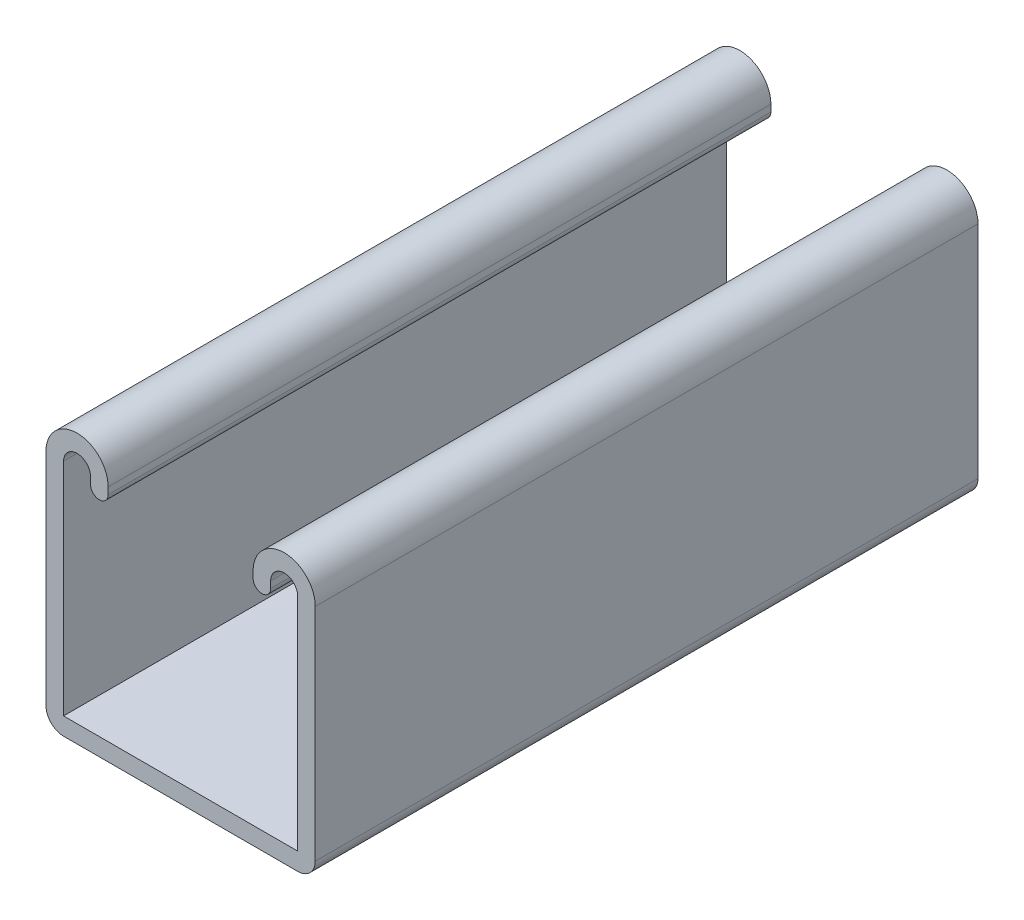
ISO-10303-21;
HEADER;
FILE_DESCRIPTION(('STEP AP214'),'2;1');
FILE_NAME('part.step','',(''),(''),'','','');
FILE_SCHEMA(('AUTOMOTIVE_DESIGN { 1 0 10303 214 1 1 1 1 }'));
ENDSEC;
DATA;
#1=APPLICATION_CONTEXT('core data for automotive mechanical design processes');
#2=APPLICATION_PROTOCOL_DEFINITION('international standard','automotive_design',2000,#1);
#3=PRODUCT_CONTEXT('',#1,'mechanical');
#4=PRODUCT('Part','Part','',(#3));
#5=PRODUCT_RELATED_PRODUCT_CATEGORY('part','',(#4));
#6=PRODUCT_DEFINITION_FORMATION('','',#4);
#7=PRODUCT_DEFINITION_CONTEXT('part definition',#1,'design');
#8=PRODUCT_DEFINITION('design','',#6,#7);
#9=PRODUCT_DEFINITION_SHAPE('','',#8);
#10=(LENGTH_UNIT() NAMED_UNIT(*) SI_UNIT(.MILLI.,.METRE.));
#11=(NAMED_UNIT(*) PLANE_ANGLE_UNIT() SI_UNIT($,.RADIAN.));
#12=(NAMED_UNIT(*) SI_UNIT($,.STERADIAN.) SOLID_ANGLE_UNIT());
#13=UNCERTAINTY_MEASURE_WITH_UNIT(LENGTH_MEASURE(1.E-05),#10,'distance_accuracy_value','');
#14=(GEOMETRIC_REPRESENTATION_CONTEXT(3) GLOBAL_UNCERTAINTY_ASSIGNED_CONTEXT((#13)) GLOBAL_UNIT_ASSIGNED_CONTEXT((#10,
#11,#12)) REPRESENTATION_CONTEXT('',''));
#15=CARTESIAN_POINT('',(0.,0.,0.));
#16=DIRECTION('',(0.,0.,1.));
#17=DIRECTION('',(1.,0.,0.));
#18=AXIS2_PLACEMENT_3D('',#15,#16,#17);
#19=CARTESIAN_POINT('',(-15.875,18.4785,101.6));
#20=DIRECTION('',(0.,0.,-1.));
#21=DIRECTION('',(-1.,0.,0.));
#22=AXIS2_PLACEMENT_3D('',#19,#20,#21);
#23=CYLINDRICAL_SURFACE('',#22,4.7625);
#24=CARTESIAN_POINT('',(-15.875,18.4785,0.));
#25=DIRECTION('',(0.,0.,1.));
#26=DIRECTION('',(-1.,0.,0.));
#27=AXIS2_PLACEMENT_3D('',#24,#25,#26);
#28=CIRCLE('',#27,4.7625);
#29=CARTESIAN_POINT('',(-11.1125,18.4785,0.));
#30=VERTEX_POINT('',#29);
#31=CARTESIAN_POINT('',(-20.6375,18.4785,0.));
#32=VERTEX_POINT('',#31);
#33=EDGE_CURVE('E189',#30,#32,#28,.T.);
#34=ORIENTED_EDGE('',*,*,#33,.T.);
#35=DIRECTION('',(0.,0.,-1.));
#36=VECTOR('',#35,1.);
#37=CARTESIAN_POINT('',(-20.6375,18.4785,101.6));
#38=LINE('',#37,#36);
#39=CARTESIAN_POINT('',(-20.6375,18.4785,101.6));
#40=VERTEX_POINT('',#39);
#41=EDGE_CURVE('E11',#40,#32,#38,.T.);
#42=ORIENTED_EDGE('',*,*,#41,.F.);
#43=CARTESIAN_POINT('',(-15.875,18.4785,101.6));
#44=DIRECTION('',(0.,0.,1.));
#45=DIRECTION('',(-1.,0.,0.));
#46=AXIS2_PLACEMENT_3D('',#43,#44,#45);
#47=CIRCLE('',#46,4.7625);
#48=CARTESIAN_POINT('',(-11.1125,18.4785,101.6));
#49=VERTEX_POINT('',#48);
#50=EDGE_CURVE('E223',#49,#40,#47,.T.);
#51=ORIENTED_EDGE('',*,*,#50,.F.);
#52=DIRECTION('',(0.,0.,-1.));
#53=VECTOR('',#52,1.);
#54=CARTESIAN_POINT('',(-11.1125,18.4785,101.6));
#55=LINE('',#54,#53);
#56=EDGE_CURVE('E185',#49,#30,#55,.T.);
#57=ORIENTED_EDGE('',*,*,#56,.T.);
#58=EDGE_LOOP('',(#34,#42,#51,#57));
#59=FACE_BOUND('',#58,.T.);
#60=ADVANCED_FACE('F32',(#59),#23,.T.);
#61=CARTESIAN_POINT('',(-20.6375,18.4785,101.6));
#62=DIRECTION('',(1.,0.,0.));
#63=DIRECTION('',(0.,1.,0.));
#64=AXIS2_PLACEMENT_3D('',#61,#62,#63);
#65=PLANE('',#64);
#66=DIRECTION('',(0.,-1.,0.));
#67=VECTOR('',#66,1.);
#68=CARTESIAN_POINT('',(-20.6375,18.4785,0.));
#69=LINE('',#68,#67);
#70=CARTESIAN_POINT('',(-20.6375,-15.3416,0.));
#71=VERTEX_POINT('',#70);
#72=EDGE_CURVE('E192',#32,#71,#69,.T.);
#73=ORIENTED_EDGE('',*,*,#72,.T.);
#74=DIRECTION('',(0.,0.,-1.));
#75=VECTOR('',#74,1.);
#76=CARTESIAN_POINT('',(-20.6375,-15.3416,101.6));
#77=LINE('',#76,#75);
#78=CARTESIAN_POINT('',(-20.6375,-15.3416,101.6));
#79=VERTEX_POINT('',#78);
#80=EDGE_CURVE('E41',#79,#71,#77,.T.);
#81=ORIENTED_EDGE('',*,*,#80,.F.);
#82=DIRECTION('',(0.,-1.,0.));
#83=VECTOR('',#82,1.);
#84=CARTESIAN_POINT('',(-20.6375,18.4785,101.6));
#85=LINE('',#84,#83);
#86=EDGE_CURVE('E122',#40,#79,#85,.T.);
#87=ORIENTED_EDGE('',*,*,#86,.F.);
#88=ORIENTED_EDGE('',*,*,#41,.T.);
#89=EDGE_LOOP('',(#73,#81,#87,#88));
#90=FACE_BOUND('',#89,.T.);
#91=ADVANCED_FACE('F332',(#90),#65,.F.);
#92=CARTESIAN_POINT('',(-17.9451,-15.3416,101.6));
#93=DIRECTION('',(0.,0.,-1.));
#94=DIRECTION('',(-1.,0.,0.));
#95=AXIS2_PLACEMENT_3D('',#92,#93,#94);
#96=CYLINDRICAL_SURFACE('',#95,2.6924);
#97=CARTESIAN_POINT('',(-17.9451,-15.3416,0.));
#98=DIRECTION('',(0.,0.,1.));
#99=DIRECTION('',(-1.,0.,0.));
#100=AXIS2_PLACEMENT_3D('',#97,#98,#99);
#101=CIRCLE('',#100,2.6924);
#102=CARTESIAN_POINT('',(-17.9451,-18.034,0.));
#103=VERTEX_POINT('',#102);
#104=EDGE_CURVE('E194',#71,#103,#101,.T.);
#105=ORIENTED_EDGE('',*,*,#104,.T.);
#106=DIRECTION('',(0.,0.,-1.));
#107=VECTOR('',#106,1.);
#108=CARTESIAN_POINT('',(-17.9451,-18.034,101.6));
#109=LINE('',#108,#107);
#110=CARTESIAN_POINT('',(-17.9451,-18.034,101.6));
#111=VERTEX_POINT('',#110);
#112=EDGE_CURVE('E260',#111,#103,#109,.T.);
#113=ORIENTED_EDGE('',*,*,#112,.F.);
#114=CARTESIAN_POINT('',(-17.9451,-15.3416,101.6));
#115=DIRECTION('',(0.,0.,1.));
#116=DIRECTION('',(-1.,0.,0.));
#117=AXIS2_PLACEMENT_3D('',#114,#115,#116);
#118=CIRCLE('',#117,2.6924);
#119=EDGE_CURVE('E269',#79,#111,#118,.T.);
#120=ORIENTED_EDGE('',*,*,#119,.F.);
#121=ORIENTED_EDGE('',*,*,#80,.T.);
#122=EDGE_LOOP('',(#105,#113,#120,#121));
#123=FACE_BOUND('',#122,.T.);
#124=ADVANCED_FACE('F267',(#123),#96,.T.);
#125=CARTESIAN_POINT('',(-17.9451,-18.034,101.6));
#126=DIRECTION('',(0.,1.,0.));
#127=DIRECTION('',(-1.,0.,0.));
#128=AXIS2_PLACEMENT_3D('',#125,#126,#127);
#129=PLANE('',#128);
#130=CARTESIAN_POINT('',(0.,-18.034,71.4375));
#131=DIRECTION('',(0.,-1.,0.));
#132=DIRECTION('',(1.,0.,0.));
#133=AXIS2_PLACEMENT_3D('',#130,#131,#132);
#134=CIRCLE('',#133,7.14375);
#135=CARTESIAN_POINT('',(7.14375,-18.034,71.4375));
#136=VERTEX_POINT('',#135);
#137=EDGE_CURVE('E451',#136,#136,#134,.T.);
#138=ORIENTED_EDGE('',*,*,#137,.F.);
#139=EDGE_LOOP('',(#138));
#140=FACE_BOUND('',#139,.T.);
#141=CARTESIAN_POINT('',(0.,-18.034,23.8125));
#142=DIRECTION('',(0.,-1.,0.));
#143=DIRECTION('',(1.,0.,0.));
#144=AXIS2_PLACEMENT_3D('',#141,#142,#143);
#145=CIRCLE('',#144,7.14375);
#146=CARTESIAN_POINT('',(7.14375,-18.034,23.8125));
#147=VERTEX_POINT('',#146);
#148=EDGE_CURVE('E455',#147,#147,#145,.T.);
#149=ORIENTED_EDGE('',*,*,#148,.F.);
#150=EDGE_LOOP('',(#149));
#151=FACE_BOUND('',#150,.T.);
#152=DIRECTION('',(1.,0.,0.));
#153=VECTOR('',#152,1.);
#154=CARTESIAN_POINT('',(-17.9451,-18.034,0.));
#155=LINE('',#154,#153);
#156=CARTESIAN_POINT('',(17.9451,-18.034,0.));
#157=VERTEX_POINT('',#156);
#158=EDGE_CURVE('E196',#103,#157,#155,.T.);
#159=ORIENTED_EDGE('',*,*,#158,.T.);
#160=DIRECTION('',(0.,0.,-1.));
#161=VECTOR('',#160,1.);
#162=CARTESIAN_POINT('',(17.9451,-18.034,101.6));
#163=LINE('',#162,#161);
#164=CARTESIAN_POINT('',(17.9451,-18.034,101.6));
#165=VERTEX_POINT('',#164);
#166=EDGE_CURVE('E257',#165,#157,#163,.T.);
#167=ORIENTED_EDGE('',*,*,#166,.F.);
#168=DIRECTION('',(1.,0.,0.));
#169=VECTOR('',#168,1.);
#170=CARTESIAN_POINT('',(-17.9451,-18.034,101.6));
#171=LINE('',#170,#169);
#172=EDGE_CURVE('E287',#111,#165,#171,.T.);
#173=ORIENTED_EDGE('',*,*,#172,.F.);
#174=ORIENTED_EDGE('',*,*,#112,.T.);
#175=EDGE_LOOP('',(#159,#167,#173,#174));
#176=FACE_BOUND('',#175,.T.);
#177=ADVANCED_FACE('F278',(#140,#151,#176),#129,.F.);
#178=CARTESIAN_POINT('',(17.9451,-15.3416,101.6));
#179=DIRECTION('',(0.,0.,-1.));
#180=DIRECTION('',(-1.,0.,0.));
#181=AXIS2_PLACEMENT_3D('',#178,#179,#180);
#182=CYLINDRICAL_SURFACE('',#181,2.6924);
#183=CARTESIAN_POINT('',(17.9451,-15.3416,0.));
#184=DIRECTION('',(0.,0.,1.));
#185=DIRECTION('',(1.,0.,0.));
#186=AXIS2_PLACEMENT_3D('',#183,#184,#185);
#187=CIRCLE('',#186,2.6924);
#188=CARTESIAN_POINT('',(20.6375,-15.3416,0.));
#189=VERTEX_POINT('',#188);
#190=EDGE_CURVE('E198',#157,#189,#187,.T.);
#191=ORIENTED_EDGE('',*,*,#190,.T.);
#192=DIRECTION('',(0.,0.,-1.));
#193=VECTOR('',#192,1.);
#194=CARTESIAN_POINT('',(20.6375,-15.3416,101.6));
#195=LINE('',#194,#193);
#196=CARTESIAN_POINT('',(20.6375,-15.3416,101.6));
#197=VERTEX_POINT('',#196);
#198=EDGE_CURVE('E254',#197,#189,#195,.T.);
#199=ORIENTED_EDGE('',*,*,#198,.F.);
#200=CARTESIAN_POINT('',(17.9451,-15.3416,101.6));
#201=DIRECTION('',(0.,0.,1.));
#202=DIRECTION('',(1.,0.,0.));
#203=AXIS2_PLACEMENT_3D('',#200,#201,#202);
#204=CIRCLE('',#203,2.6924);
#205=EDGE_CURVE('E284',#165,#197,#204,.T.);
#206=ORIENTED_EDGE('',*,*,#205,.F.);
#207=ORIENTED_EDGE('',*,*,#166,.T.);
#208=EDGE_LOOP('',(#191,#199,#206,#207));
#209=FACE_BOUND('',#208,.T.);
#210=ADVANCED_FACE('F282',(#209),#182,.T.);
#211=CARTESIAN_POINT('',(20.6375,-15.3416,101.6));
#212=DIRECTION('',(-1.,0.,0.));
#213=DIRECTION('',(0.,0.,1.));
#214=AXIS2_PLACEMENT_3D('',#211,#212,#213);
#215=PLANE('',#214);
#216=DIRECTION('',(0.,1.,0.));
#217=VECTOR('',#216,1.);
#218=CARTESIAN_POINT('',(20.6375,-15.3416,0.));
#219=LINE('',#218,#217);
#220=CARTESIAN_POINT('',(20.6375,18.4785,0.));
#221=VERTEX_POINT('',#220);
#222=EDGE_CURVE('E200',#189,#221,#219,.T.);
#223=ORIENTED_EDGE('',*,*,#222,.T.);
#224=DIRECTION('',(0.,0.,-1.));
#225=VECTOR('',#224,1.);
#226=CARTESIAN_POINT('',(20.6375,18.4785,101.6));
#227=LINE('',#226,#225);
#228=CARTESIAN_POINT('',(20.6375,18.4785,101.6));
#229=VERTEX_POINT('',#228);
#230=EDGE_CURVE('E251',#229,#221,#227,.T.);
#231=ORIENTED_EDGE('',*,*,#230,.F.);
#232=DIRECTION('',(0.,1.,0.));
#233=VECTOR('',#232,1.);
#234=CARTESIAN_POINT('',(20.6375,-15.3416,101.6));
#235=LINE('',#234,#233);
#236=EDGE_CURVE('E286',#197,#229,#235,.T.);
#237=ORIENTED_EDGE('',*,*,#236,.F.);
#238=ORIENTED_EDGE('',*,*,#198,.T.);
#239=EDGE_LOOP('',(#223,#231,#237,#238));
#240=FACE_BOUND('',#239,.T.);
#241=ADVANCED_FACE('F346',(#240),#215,.F.);
#242=CARTESIAN_POINT('',(15.875,18.4785,101.6));
#243=DIRECTION('',(0.,0.,-1.));
#244=DIRECTION('',(-1.,0.,0.));
#245=AXIS2_PLACEMENT_3D('',#242,#243,#244);
#246=CYLINDRICAL_SURFACE('',#245,4.7625);
#247=CARTESIAN_POINT('',(15.875,18.4785,0.));
#248=DIRECTION('',(0.,0.,1.));
#249=DIRECTION('',(1.,0.,0.));
#250=AXIS2_PLACEMENT_3D('',#247,#248,#249);
#251=CIRCLE('',#250,4.7625);
#252=CARTESIAN_POINT('',(11.1125,18.4785,0.));
#253=VERTEX_POINT('',#252);
#254=EDGE_CURVE('E202',#221,#253,#251,.T.);
#255=ORIENTED_EDGE('',*,*,#254,.T.);
#256=DIRECTION('',(0.,0.,-1.));
#257=VECTOR('',#256,1.);
#258=CARTESIAN_POINT('',(11.1125,18.4785,101.6));
#259=LINE('',#258,#257);
#260=CARTESIAN_POINT('',(11.1125,18.4785,101.6));
#261=VERTEX_POINT('',#260);
#262=EDGE_CURVE('E248',#261,#253,#259,.T.);
#263=ORIENTED_EDGE('',*,*,#262,.F.);
#264=CARTESIAN_POINT('',(15.875,18.4785,101.6));
#265=DIRECTION('',(0.,0.,1.));
#266=DIRECTION('',(1.,0.,0.));
#267=AXIS2_PLACEMENT_3D('',#264,#265,#266);
#268=CIRCLE('',#267,4.7625);
#269=EDGE_CURVE('E289',#229,#261,#268,.T.);
#270=ORIENTED_EDGE('',*,*,#269,.F.);
#271=ORIENTED_EDGE('',*,*,#230,.T.);
#272=EDGE_LOOP('',(#255,#263,#270,#271));
#273=FACE_BOUND('',#272,.T.);
#274=ADVANCED_FACE('F349',(#273),#246,.T.);
#275=CARTESIAN_POINT('',(11.1125,18.4785,101.6));
#276=DIRECTION('',(1.,0.,0.));
#277=DIRECTION('',(0.,1.,0.));
#278=AXIS2_PLACEMENT_3D('',#275,#276,#277);
#279=PLANE('',#278);
#280=DIRECTION('',(0.,-1.,0.));
#281=VECTOR('',#280,1.);
#282=CARTESIAN_POINT('',(11.1125,18.4785,0.));
#283=LINE('',#282,#281);
#284=CARTESIAN_POINT('',(11.1125,17.44345,0.));
#285=VERTEX_POINT('',#284);
#286=EDGE_CURVE('E204',#253,#285,#283,.T.);
#287=ORIENTED_EDGE('',*,*,#286,.T.);
#288=DIRECTION('',(0.,0.,-1.));
#289=VECTOR('',#288,1.);
#290=CARTESIAN_POINT('',(11.1125,17.44345,101.6));
#291=LINE('',#290,#289);
#292=CARTESIAN_POINT('',(11.1125,17.44345,101.6));
#293=VERTEX_POINT('',#292);
#294=EDGE_CURVE('E245',#293,#285,#291,.T.);
#295=ORIENTED_EDGE('',*,*,#294,.F.);
#296=DIRECTION('',(0.,-1.,0.));
#297=VECTOR('',#296,1.);
#298=CARTESIAN_POINT('',(11.1125,18.4785,101.6));
#299=LINE('',#298,#297);
#300=EDGE_CURVE('E295',#261,#293,#299,.T.);
#301=ORIENTED_EDGE('',*,*,#300,.F.);
#302=ORIENTED_EDGE('',*,*,#262,.T.);
#303=EDGE_LOOP('',(#287,#295,#301,#302));
#304=FACE_BOUND('',#303,.T.);
#305=ADVANCED_FACE('F353',(#304),#279,.F.);
#306=CARTESIAN_POINT('',(12.4587,17.44345,101.6));
#307=DIRECTION('',(0.,0.,-1.));
#308=DIRECTION('',(-1.,0.,0.));
#309=AXIS2_PLACEMENT_3D('',#306,#307,#308);
#310=CYLINDRICAL_SURFACE('',#309,1.3462);
#311=CARTESIAN_POINT('',(12.4587,17.44345,0.));
#312=DIRECTION('',(0.,0.,1.));
#313=DIRECTION('',(1.,0.,0.));
#314=AXIS2_PLACEMENT_3D('',#311,#312,#313);
#315=CIRCLE('',#314,1.3462);
#316=CARTESIAN_POINT('',(13.8049,17.44345,0.));
#317=VERTEX_POINT('',#316);
#318=EDGE_CURVE('E206',#285,#317,#315,.T.);
#319=ORIENTED_EDGE('',*,*,#318,.T.);
#320=DIRECTION('',(0.,0.,-1.));
#321=VECTOR('',#320,1.);
#322=CARTESIAN_POINT('',(13.8049,17.44345,101.6));
#323=LINE('',#322,#321);
#324=CARTESIAN_POINT('',(13.8049,17.44345,101.6));
#325=VERTEX_POINT('',#324);
#326=EDGE_CURVE('E242',#325,#317,#323,.T.);
#327=ORIENTED_EDGE('',*,*,#326,.F.);
#328=CARTESIAN_POINT('',(12.4587,17.44345,101.6));
#329=DIRECTION('',(0.,0.,1.));
#330=DIRECTION('',(1.,0.,0.));
#331=AXIS2_PLACEMENT_3D('',#328,#329,#330);
#332=CIRCLE('',#331,1.3462);
#333=EDGE_CURVE('E297',#293,#325,#332,.T.);
#334=ORIENTED_EDGE('',*,*,#333,.F.);
#335=ORIENTED_EDGE('',*,*,#294,.T.);
#336=EDGE_LOOP('',(#319,#327,#334,#335));
#337=FACE_BOUND('',#336,.T.);
#338=ADVANCED_FACE('F357',(#337),#310,.T.);
#339=CARTESIAN_POINT('',(13.8049,18.4785,101.6));
#340=DIRECTION('',(-1.,0.,0.));
#341=DIRECTION('',(0.,0.,1.));
#342=AXIS2_PLACEMENT_3D('',#339,#340,#341);
#343=PLANE('',#342);
#344=DIRECTION('',(0.,1.,0.));
#345=VECTOR('',#344,1.);
#346=CARTESIAN_POINT('',(13.8049,18.4785,0.));
#347=LINE('',#346,#345);
#348=CARTESIAN_POINT('',(13.8049,18.4785,0.));
#349=VERTEX_POINT('',#348);
#350=EDGE_CURVE('E208',#317,#349,#347,.T.);
#351=ORIENTED_EDGE('',*,*,#350,.T.);
#352=DIRECTION('',(0.,0.,-1.));
#353=VECTOR('',#352,1.);
#354=CARTESIAN_POINT('',(13.8049,18.4785,101.6));
#355=LINE('',#354,#353);
#356=CARTESIAN_POINT('',(13.8049,18.4785,101.6));
#357=VERTEX_POINT('',#356);
#358=EDGE_CURVE('E239',#357,#349,#355,.T.);
#359=ORIENTED_EDGE('',*,*,#358,.F.);
#360=DIRECTION('',(0.,1.,0.));
#361=VECTOR('',#360,1.);
#362=CARTESIAN_POINT('',(13.8049,18.4785,101.6));
#363=LINE('',#362,#361);
#364=EDGE_CURVE('E299',#325,#357,#363,.T.);
#365=ORIENTED_EDGE('',*,*,#364,.F.);
#366=ORIENTED_EDGE('',*,*,#326,.T.);
#367=EDGE_LOOP('',(#351,#359,#365,#366));
#368=FACE_BOUND('',#367,.T.);
#369=ADVANCED_FACE('F361',(#368),#343,.F.);
#370=CARTESIAN_POINT('',(15.875,18.4785,101.6));
#371=DIRECTION('',(0.,0.,-1.));
#372=DIRECTION('',(-1.,0.,0.));
#373=AXIS2_PLACEMENT_3D('',#370,#371,#372);
#374=CYLINDRICAL_SURFACE('',#373,2.0701);
#375=CARTESIAN_POINT('',(15.875,18.4785,0.));
#376=DIRECTION('',(0.,0.,-1.));
#377=DIRECTION('',(1.,0.,0.));
#378=AXIS2_PLACEMENT_3D('',#375,#376,#377);
#379=CIRCLE('',#378,2.0701);
#380=CARTESIAN_POINT('',(17.9451,18.4785,0.));
#381=VERTEX_POINT('',#380);
#382=EDGE_CURVE('E210',#349,#381,#379,.T.);
#383=ORIENTED_EDGE('',*,*,#382,.T.);
#384=DIRECTION('',(0.,0.,-1.));
#385=VECTOR('',#384,1.);
#386=CARTESIAN_POINT('',(17.9451,18.4785,101.6));
#387=LINE('',#386,#385);
#388=CARTESIAN_POINT('',(17.9451,18.4785,101.6));
#389=VERTEX_POINT('',#388);
#390=EDGE_CURVE('E236',#389,#381,#387,.T.);
#391=ORIENTED_EDGE('',*,*,#390,.F.);
#392=CARTESIAN_POINT('',(15.875,18.4785,101.6));
#393=DIRECTION('',(0.,0.,-1.));
#394=DIRECTION('',(1.,0.,0.));
#395=AXIS2_PLACEMENT_3D('',#392,#393,#394);
#396=CIRCLE('',#395,2.0701);
#397=EDGE_CURVE('E301',#357,#389,#396,.T.);
#398=ORIENTED_EDGE('',*,*,#397,.F.);
#399=ORIENTED_EDGE('',*,*,#358,.T.);
#400=EDGE_LOOP('',(#383,#391,#398,#399));
#401=FACE_BOUND('',#400,.T.);
#402=ADVANCED_FACE('F365',(#401),#374,.F.);
#403=CARTESIAN_POINT('',(17.9451,-15.3416,101.6));
#404=DIRECTION('',(1.,0.,0.));
#405=DIRECTION('',(0.,1.,0.));
#406=AXIS2_PLACEMENT_3D('',#403,#404,#405);
#407=PLANE('',#406);
#408=DIRECTION('',(0.,-1.,0.));
#409=VECTOR('',#408,1.);
#410=CARTESIAN_POINT('',(17.9451,-15.3416,0.));
#411=LINE('',#410,#409);
#412=CARTESIAN_POINT('',(17.9451,-15.3416,0.));
#413=VERTEX_POINT('',#412);
#414=EDGE_CURVE('E212',#381,#413,#411,.T.);
#415=ORIENTED_EDGE('',*,*,#414,.T.);
#416=DIRECTION('',(0.,0.,-1.));
#417=VECTOR('',#416,1.);
#418=CARTESIAN_POINT('',(17.9451,-15.3416,101.6));
#419=LINE('',#418,#417);
#420=CARTESIAN_POINT('',(17.9451,-15.3416,101.6));
#421=VERTEX_POINT('',#420);
#422=EDGE_CURVE('E233',#421,#413,#419,.T.);
#423=ORIENTED_EDGE('',*,*,#422,.F.);
#424=DIRECTION('',(0.,-1.,0.));
#425=VECTOR('',#424,1.);
#426=CARTESIAN_POINT('',(17.9451,-15.3416,101.6));
#427=LINE('',#426,#425);
#428=EDGE_CURVE('E303',#389,#421,#427,.T.);
#429=ORIENTED_EDGE('',*,*,#428,.F.);
#430=ORIENTED_EDGE('',*,*,#390,.T.);
#431=EDGE_LOOP('',(#415,#423,#429,#430));
#432=FACE_BOUND('',#431,.T.);
#433=ADVANCED_FACE('F369',(#432),#407,.F.);
#434=CARTESIAN_POINT('',(-17.9451,-15.3416,101.6));
#435=DIRECTION('',(0.,-1.,0.));
#436=DIRECTION('',(1.,0.,0.));
#437=AXIS2_PLACEMENT_3D('',#434,#435,#436);
#438=PLANE('',#437);
#439=CARTESIAN_POINT('',(0.,-15.3416,71.4375));
#440=DIRECTION('',(0.,-1.,0.));
#441=DIRECTION('',(1.,0.,0.));
#442=AXIS2_PLACEMENT_3D('',#439,#440,#441);
#443=CIRCLE('',#442,7.14375);
#444=CARTESIAN_POINT('',(7.14375,-15.3416,71.4375));
#445=VERTEX_POINT('',#444);
#446=EDGE_CURVE('E454',#445,#445,#443,.T.);
#447=ORIENTED_EDGE('',*,*,#446,.T.);
#448=EDGE_LOOP('',(#447));
#449=FACE_BOUND('',#448,.T.);
#450=CARTESIAN_POINT('',(0.,-15.3416,23.8125));
#451=DIRECTION('',(0.,-1.,0.));
#452=DIRECTION('',(1.,0.,0.));
#453=AXIS2_PLACEMENT_3D('',#450,#451,#452);
#454=CIRCLE('',#453,7.14375);
#455=CARTESIAN_POINT('',(7.14375,-15.3416,23.8125));
#456=VERTEX_POINT('',#455);
#457=EDGE_CURVE('E35',#456,#456,#454,.T.);
#458=ORIENTED_EDGE('',*,*,#457,.T.);
#459=EDGE_LOOP('',(#458));
#460=FACE_BOUND('',#459,.T.);
#461=DIRECTION('',(-1.,0.,0.));
#462=VECTOR('',#461,1.);
#463=CARTESIAN_POINT('',(-17.9451,-15.3416,0.));
#464=LINE('',#463,#462);
#465=CARTESIAN_POINT('',(-17.9451,-15.3416,0.));
#466=VERTEX_POINT('',#465);
#467=EDGE_CURVE('E214',#413,#466,#464,.T.);
#468=ORIENTED_EDGE('',*,*,#467,.T.);
#469=DIRECTION('',(0.,0.,-1.));
#470=VECTOR('',#469,1.);
#471=CARTESIAN_POINT('',(-17.9451,-15.3416,101.6));
#472=LINE('',#471,#470);
#473=CARTESIAN_POINT('',(-17.9451,-15.3416,101.6));
#474=VERTEX_POINT('',#473);
#475=EDGE_CURVE('E230',#474,#466,#472,.T.);
#476=ORIENTED_EDGE('',*,*,#475,.F.);
#477=DIRECTION('',(-1.,0.,0.));
#478=VECTOR('',#477,1.);
#479=CARTESIAN_POINT('',(-17.9451,-15.3416,101.6));
#480=LINE('',#479,#478);
#481=EDGE_CURVE('E305',#421,#474,#480,.T.);
#482=ORIENTED_EDGE('',*,*,#481,.F.);
#483=ORIENTED_EDGE('',*,*,#422,.T.);
#484=EDGE_LOOP('',(#468,#476,#482,#483));
#485=FACE_BOUND('',#484,.T.);
#486=ADVANCED_FACE('F373',(#449,#460,#485),#438,.F.);
#487=CARTESIAN_POINT('',(-17.9451,18.4785,101.6));
#488=DIRECTION('',(-1.,0.,0.));
#489=DIRECTION('',(0.,-1.,0.));
#490=AXIS2_PLACEMENT_3D('',#487,#488,#489);
#491=PLANE('',#490);
#492=DIRECTION('',(0.,1.,0.));
#493=VECTOR('',#492,1.);
#494=CARTESIAN_POINT('',(-17.9451,18.4785,0.));
#495=LINE('',#494,#493);
#496=CARTESIAN_POINT('',(-17.9451,18.4785,0.));
#497=VERTEX_POINT('',#496);
#498=EDGE_CURVE('E216',#466,#497,#495,.T.);
#499=ORIENTED_EDGE('',*,*,#498,.T.);
#500=DIRECTION('',(0.,0.,-1.));
#501=VECTOR('',#500,1.);
#502=CARTESIAN_POINT('',(-17.9451,18.4785,101.6));
#503=LINE('',#502,#501);
#504=CARTESIAN_POINT('',(-17.9451,18.4785,101.6));
#505=VERTEX_POINT('',#504);
#506=EDGE_CURVE('E227',#505,#497,#503,.T.);
#507=ORIENTED_EDGE('',*,*,#506,.F.);
#508=DIRECTION('',(0.,1.,0.));
#509=VECTOR('',#508,1.);
#510=CARTESIAN_POINT('',(-17.9451,18.4785,101.6));
#511=LINE('',#510,#509);
#512=EDGE_CURVE('E307',#474,#505,#511,.T.);
#513=ORIENTED_EDGE('',*,*,#512,.F.);
#514=ORIENTED_EDGE('',*,*,#475,.T.);
#515=EDGE_LOOP('',(#499,#507,#513,#514));
#516=FACE_BOUND('',#515,.T.);
#517=ADVANCED_FACE('F313',(#516),#491,.F.);
#518=CARTESIAN_POINT('',(-15.875,18.4785,101.6));
#519=DIRECTION('',(0.,0.,-1.));
#520=DIRECTION('',(-1.,0.,0.));
#521=AXIS2_PLACEMENT_3D('',#518,#519,#520);
#522=CYLINDRICAL_SURFACE('',#521,2.0701);
#523=CARTESIAN_POINT('',(-15.875,18.4785,0.));
#524=DIRECTION('',(0.,0.,-1.));
#525=DIRECTION('',(-1.,0.,0.));
#526=AXIS2_PLACEMENT_3D('',#523,#524,#525);
#527=CIRCLE('',#526,2.0701);
#528=CARTESIAN_POINT('',(-13.8049,18.4785,0.));
#529=VERTEX_POINT('',#528);
#530=EDGE_CURVE('E218',#497,#529,#527,.T.);
#531=ORIENTED_EDGE('',*,*,#530,.T.);
#532=DIRECTION('',(0.,0.,-1.));
#533=VECTOR('',#532,1.);
#534=CARTESIAN_POINT('',(-13.8049,18.4785,101.6));
#535=LINE('',#534,#533);
#536=CARTESIAN_POINT('',(-13.8049,18.4785,101.6));
#537=VERTEX_POINT('',#536);
#538=EDGE_CURVE('E180',#537,#529,#535,.T.);
#539=ORIENTED_EDGE('',*,*,#538,.F.);
#540=CARTESIAN_POINT('',(-15.875,18.4785,101.6));
#541=DIRECTION('',(0.,0.,-1.));
#542=DIRECTION('',(-1.,0.,0.));
#543=AXIS2_PLACEMENT_3D('',#540,#541,#542);
#544=CIRCLE('',#543,2.0701);
#545=EDGE_CURVE('E171',#505,#537,#544,.T.);
#546=ORIENTED_EDGE('',*,*,#545,.F.);
#547=ORIENTED_EDGE('',*,*,#506,.T.);
#548=EDGE_LOOP('',(#531,#539,#546,#547));
#549=FACE_BOUND('',#548,.T.);
#550=ADVANCED_FACE('F317',(#549),#522,.F.);
#551=CARTESIAN_POINT('',(-13.8049,18.4785,101.6));
#552=DIRECTION('',(1.,0.,0.));
#553=DIRECTION('',(0.,1.,0.));
#554=AXIS2_PLACEMENT_3D('',#551,#552,#553);
#555=PLANE('',#554);
#556=DIRECTION('',(0.,-1.,0.));
#557=VECTOR('',#556,1.);
#558=CARTESIAN_POINT('',(-13.8049,18.4785,0.));
#559=LINE('',#558,#557);
#560=CARTESIAN_POINT('',(-13.8049,17.44345,0.));
#561=VERTEX_POINT('',#560);
#562=EDGE_CURVE('E179',#529,#561,#559,.T.);
#563=ORIENTED_EDGE('',*,*,#562,.T.);
#564=DIRECTION('',(0.,0.,-1.));
#565=VECTOR('',#564,1.);
#566=CARTESIAN_POINT('',(-13.8049,17.44345,101.6));
#567=LINE('',#566,#565);
#568=CARTESIAN_POINT('',(-13.8049,17.44345,101.6));
#569=VERTEX_POINT('',#568);
#570=EDGE_CURVE('E176',#569,#561,#567,.T.);
#571=ORIENTED_EDGE('',*,*,#570,.F.);
#572=DIRECTION('',(0.,-1.,0.));
#573=VECTOR('',#572,1.);
#574=CARTESIAN_POINT('',(-13.8049,18.4785,101.6));
#575=LINE('',#574,#573);
#576=EDGE_CURVE('E165',#537,#569,#575,.T.);
#577=ORIENTED_EDGE('',*,*,#576,.F.);
#578=ORIENTED_EDGE('',*,*,#538,.T.);
#579=EDGE_LOOP('',(#563,#571,#577,#578));
#580=FACE_BOUND('',#579,.T.);
#581=ADVANCED_FACE('F177',(#580),#555,.F.);
#582=CARTESIAN_POINT('',(-12.4587,17.44345,101.6));
#583=DIRECTION('',(0.,0.,-1.));
#584=DIRECTION('',(-1.,0.,0.));
#585=AXIS2_PLACEMENT_3D('',#582,#583,#584);
#586=CYLINDRICAL_SURFACE('',#585,1.3462);
#587=CARTESIAN_POINT('',(-12.4587,17.44345,0.));
#588=DIRECTION('',(0.,0.,1.));
#589=DIRECTION('',(-1.,0.,0.));
#590=AXIS2_PLACEMENT_3D('',#587,#588,#589);
#591=CIRCLE('',#590,1.3462);
#592=CARTESIAN_POINT('',(-11.1125,17.44345,0.));
#593=VERTEX_POINT('',#592);
#594=EDGE_CURVE('E108',#561,#593,#591,.T.);
#595=ORIENTED_EDGE('',*,*,#594,.T.);
#596=DIRECTION('',(0.,0.,-1.));
#597=VECTOR('',#596,1.);
#598=CARTESIAN_POINT('',(-11.1125,17.44345,101.6));
#599=LINE('',#598,#597);
#600=CARTESIAN_POINT('',(-11.1125,17.44345,101.6));
#601=VERTEX_POINT('',#600);
#602=EDGE_CURVE('E181',#601,#593,#599,.T.);
#603=ORIENTED_EDGE('',*,*,#602,.F.);
#604=CARTESIAN_POINT('',(-12.4587,17.44345,101.6));
#605=DIRECTION('',(0.,0.,1.));
#606=DIRECTION('',(-1.,0.,0.));
#607=AXIS2_PLACEMENT_3D('',#604,#605,#606);
#608=CIRCLE('',#607,1.3462);
#609=EDGE_CURVE('E169',#569,#601,#608,.T.);
#610=ORIENTED_EDGE('',*,*,#609,.F.);
#611=ORIENTED_EDGE('',*,*,#570,.T.);
#612=EDGE_LOOP('',(#595,#603,#610,#611));
#613=FACE_BOUND('',#612,.T.);
#614=ADVANCED_FACE('F183',(#613),#586,.T.);
#615=CARTESIAN_POINT('',(-11.1125,18.4785,101.6));
#616=DIRECTION('',(-1.,0.,0.));
#617=DIRECTION('',(0.,0.,1.));
#618=AXIS2_PLACEMENT_3D('',#615,#616,#617);
#619=PLANE('',#618);
#620=DIRECTION('',(0.,1.,0.));
#621=VECTOR('',#620,1.);
#622=CARTESIAN_POINT('',(-11.1125,18.4785,0.));
#623=LINE('',#622,#621);
#624=EDGE_CURVE('E114',#593,#30,#623,.T.);
#625=ORIENTED_EDGE('',*,*,#624,.T.);
#626=ORIENTED_EDGE('',*,*,#56,.F.);
#627=DIRECTION('',(0.,1.,0.));
#628=VECTOR('',#627,1.);
#629=CARTESIAN_POINT('',(-11.1125,18.4785,101.6));
#630=LINE('',#629,#628);
#631=EDGE_CURVE('E49',#601,#49,#630,.T.);
#632=ORIENTED_EDGE('',*,*,#631,.F.);
#633=ORIENTED_EDGE('',*,*,#602,.T.);
#634=EDGE_LOOP('',(#625,#626,#632,#633));
#635=FACE_BOUND('',#634,.T.);
#636=ADVANCED_FACE('F321',(#635),#619,.F.);
#637=CARTESIAN_POINT('',(-15.875,18.4785,101.6));
#638=DIRECTION('',(0.,0.,-1.));
#639=DIRECTION('',(-1.,0.,0.));
#640=AXIS2_PLACEMENT_3D('',#637,#638,#639);
#641=PLANE('',#640);
#642=ORIENTED_EDGE('',*,*,#50,.T.);
#643=ORIENTED_EDGE('',*,*,#86,.T.);
#644=ORIENTED_EDGE('',*,*,#119,.T.);
#645=ORIENTED_EDGE('',*,*,#172,.T.);
#646=ORIENTED_EDGE('',*,*,#205,.T.);
#647=ORIENTED_EDGE('',*,*,#236,.T.);
#648=ORIENTED_EDGE('',*,*,#269,.T.);
#649=ORIENTED_EDGE('',*,*,#300,.T.);
#650=ORIENTED_EDGE('',*,*,#333,.T.);
#651=ORIENTED_EDGE('',*,*,#364,.T.);
#652=ORIENTED_EDGE('',*,*,#397,.T.);
#653=ORIENTED_EDGE('',*,*,#428,.T.);
#654=ORIENTED_EDGE('',*,*,#481,.T.);
#655=ORIENTED_EDGE('',*,*,#512,.T.);
#656=ORIENTED_EDGE('',*,*,#545,.T.);
#657=ORIENTED_EDGE('',*,*,#576,.T.);
#658=ORIENTED_EDGE('',*,*,#609,.T.);
#659=ORIENTED_EDGE('',*,*,#631,.T.);
#660=EDGE_LOOP('',(#642,#643,#644,#645,#646,#647,#648,#649,#650,#651,#652,#653,#654,#655,#656,
#657,#658,#659));
#661=FACE_BOUND('',#660,.T.);
#662=ADVANCED_FACE('F167',(#661),#641,.F.);
#663=CARTESIAN_POINT('',(-15.875,18.4785,0.));
#664=DIRECTION('',(0.,0.,-1.));
#665=DIRECTION('',(-1.,0.,0.));
#666=AXIS2_PLACEMENT_3D('',#663,#664,#665);
#667=PLANE('',#666);
#668=ORIENTED_EDGE('',*,*,#33,.F.);
#669=ORIENTED_EDGE('',*,*,#624,.F.);
#670=ORIENTED_EDGE('',*,*,#594,.F.);
#671=ORIENTED_EDGE('',*,*,#562,.F.);
#672=ORIENTED_EDGE('',*,*,#530,.F.);
#673=ORIENTED_EDGE('',*,*,#498,.F.);
#674=ORIENTED_EDGE('',*,*,#467,.F.);
#675=ORIENTED_EDGE('',*,*,#414,.F.);
#676=ORIENTED_EDGE('',*,*,#382,.F.);
#677=ORIENTED_EDGE('',*,*,#350,.F.);
#678=ORIENTED_EDGE('',*,*,#318,.F.);
#679=ORIENTED_EDGE('',*,*,#286,.F.);
#680=ORIENTED_EDGE('',*,*,#254,.F.);
#681=ORIENTED_EDGE('',*,*,#222,.F.);
#682=ORIENTED_EDGE('',*,*,#190,.F.);
#683=ORIENTED_EDGE('',*,*,#158,.F.);
#684=ORIENTED_EDGE('',*,*,#104,.F.);
#685=ORIENTED_EDGE('',*,*,#72,.F.);
#686=EDGE_LOOP('',(#668,#669,#670,#671,#672,#673,#674,#675,#676,#677,#678,#679,#680,#681,#682,
#683,#684,#685));
#687=FACE_BOUND('',#686,.T.);
#688=ADVANCED_FACE('F273',(#687),#667,.T.);
#689=CARTESIAN_POINT('',(0.,23.241,23.8125));
#690=DIRECTION('',(0.,-1.,0.));
#691=DIRECTION('',(1.,0.,0.));
#692=AXIS2_PLACEMENT_3D('',#689,#690,#691);
#693=CYLINDRICAL_SURFACE('',#692,7.14375);
#694=ORIENTED_EDGE('',*,*,#148,.T.);
#695=EDGE_LOOP('',(#694));
#696=FACE_BOUND('',#695,.T.);
#697=ORIENTED_EDGE('',*,*,#457,.F.);
#698=EDGE_LOOP('',(#697));
#699=FACE_BOUND('',#698,.T.);
#700=ADVANCED_FACE('F410',(#696,#699),#693,.F.);
#701=CARTESIAN_POINT('',(0.,23.241,71.4375));
#702=DIRECTION('',(0.,-1.,0.));
#703=DIRECTION('',(1.,0.,0.));
#704=AXIS2_PLACEMENT_3D('',#701,#702,#703);
#705=CYLINDRICAL_SURFACE('',#704,7.14375);
#706=ORIENTED_EDGE('',*,*,#137,.T.);
#707=EDGE_LOOP('',(#706));
#708=FACE_BOUND('',#707,.T.);
#709=ORIENTED_EDGE('',*,*,#446,.F.);
#710=EDGE_LOOP('',(#709));
#711=FACE_BOUND('',#710,.T.);
#712=ADVANCED_FACE('F418',(#708,#711),#705,.F.);
#713=CLOSED_SHELL('',(#60,#91,#124,#177,#210,#241,#274,#305,#338,#369,#402,#433,#486,#517,#550,
#581,#614,#636,#662,#688,#700,#712));
#714=MANIFOLD_SOLID_BREP('B2',#713);
#715=ADVANCED_BREP_SHAPE_REPRESENTATION('',(#18,#714),#14);
#716=SHAPE_DEFINITION_REPRESENTATION(#9,#715);
ENDSEC;
END-ISO-10303-21;
